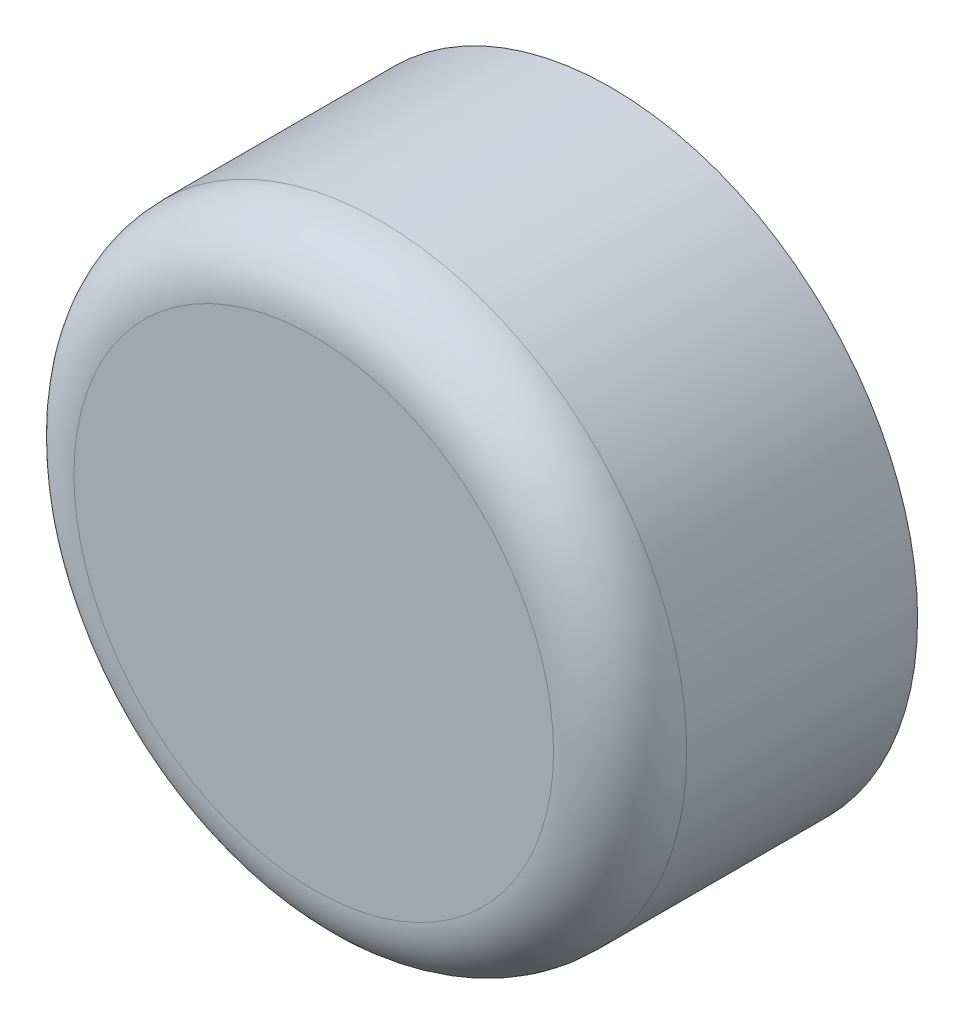
ISO-10303-21;
HEADER;
FILE_DESCRIPTION(('STEP AP214'),'2;1');
FILE_NAME('part.step','',(''),(''),'','','');
FILE_SCHEMA(('AUTOMOTIVE_DESIGN { 1 0 10303 214 1 1 1 1 }'));
ENDSEC;
DATA;
#1=APPLICATION_CONTEXT('core data for automotive mechanical design processes');
#2=APPLICATION_PROTOCOL_DEFINITION('international standard','automotive_design',2000,#1);
#3=PRODUCT_CONTEXT('',#1,'mechanical');
#4=PRODUCT('Part','Part','',(#3));
#5=PRODUCT_RELATED_PRODUCT_CATEGORY('part','',(#4));
#6=PRODUCT_DEFINITION_FORMATION('','',#4);
#7=PRODUCT_DEFINITION_CONTEXT('part definition',#1,'design');
#8=PRODUCT_DEFINITION('design','',#6,#7);
#9=PRODUCT_DEFINITION_SHAPE('','',#8);
#10=(LENGTH_UNIT() NAMED_UNIT(*) SI_UNIT(.MILLI.,.METRE.));
#11=(NAMED_UNIT(*) PLANE_ANGLE_UNIT() SI_UNIT($,.RADIAN.));
#12=(NAMED_UNIT(*) SI_UNIT($,.STERADIAN.) SOLID_ANGLE_UNIT());
#13=UNCERTAINTY_MEASURE_WITH_UNIT(LENGTH_MEASURE(1.E-05),#10,'distance_accuracy_value','');
#14=(GEOMETRIC_REPRESENTATION_CONTEXT(3) GLOBAL_UNCERTAINTY_ASSIGNED_CONTEXT((#13)) GLOBAL_UNIT_ASSIGNED_CONTEXT((#10,
#11,#12)) REPRESENTATION_CONTEXT('',''));
#15=CARTESIAN_POINT('',(0.,0.,0.));
#16=DIRECTION('',(0.,0.,1.));
#17=DIRECTION('',(1.,0.,0.));
#18=AXIS2_PLACEMENT_3D('',#15,#16,#17);
#19=CARTESIAN_POINT('',(0.,0.,1.3208));
#20=DIRECTION('',(0.,0.,1.));
#21=DIRECTION('',(1.,0.,0.));
#22=AXIS2_PLACEMENT_3D('',#19,#20,#21);
#23=TOROIDAL_SURFACE('',#22,1.3716,0.381);
#24=CARTESIAN_POINT('',(0.,0.,1.3208));
#25=DIRECTION('',(0.,0.,1.));
#26=DIRECTION('',(-1.,0.,0.));
#27=AXIS2_PLACEMENT_3D('',#24,#25,#26);
#28=CIRCLE('',#27,1.7526);
#29=CARTESIAN_POINT('',(1.7526,0.,1.3208));
#30=VERTEX_POINT('',#29);
#31=EDGE_CURVE('E11',#30,#30,#28,.T.);
#32=ORIENTED_EDGE('',*,*,#31,.T.);
#33=CARTESIAN_POINT('',(1.75260000000001,0.,1.32079999999995));
#34=CARTESIAN_POINT('',(1.75259999999996,0.,1.42265531438122));
#35=CARTESIAN_POINT('',(1.72021334240857,0.,1.52185696615386));
#36=CARTESIAN_POINT('',(1.65808133453009,0.,1.60728133453004));
#37=CARTESIAN_POINT('',(1.57265696615383,0.,1.66941334240859));
#38=CARTESIAN_POINT('',(1.47345531438122,0.,1.70179999999997));
#39=CARTESIAN_POINT('',(1.37160000000005,0.,1.70180000000001));
#40=(BOUNDED_CURVE() B_SPLINE_CURVE(6,(#33,#34,#35,#36,#37,#38,#39),.UNSPECIFIED.,.F.,
.F.) B_SPLINE_CURVE_WITH_KNOTS((7,7),(0.,1.5707963267949),
.UNSPECIFIED.) CURVE() GEOMETRIC_REPRESENTATION_ITEM() RATIONAL_B_SPLINE_CURVE((1.03139347178751,
1.01002540766144,0.997924642724974,0.993958444136924,0.997924642724975,1.01002540766144,1.03139347178751)) REPRESENTATION_ITEM(''));
#41=CARTESIAN_POINT('',(1.3716,0.,1.7018));
#42=VERTEX_POINT('',#41);
#43=EDGE_CURVE('E24',#30,#42,#40,.T.);
#44=ORIENTED_EDGE('',*,*,#43,.T.);
#45=CARTESIAN_POINT('',(0.,0.,1.7018));
#46=DIRECTION('',(0.,0.,-1.));
#47=DIRECTION('',(-1.,0.,0.));
#48=AXIS2_PLACEMENT_3D('',#45,#46,#47);
#49=CIRCLE('',#48,1.3716);
#50=EDGE_CURVE('E42',#42,#42,#49,.T.);
#51=ORIENTED_EDGE('',*,*,#50,.T.);
#52=ORIENTED_EDGE('',*,*,#43,.F.);
#53=EDGE_LOOP('',(#32,#44,#51,#52));
#54=FACE_BOUND('',#53,.T.);
#55=ADVANCED_FACE('F17',(#54),#23,.T.);
#56=CARTESIAN_POINT('',(0.,0.,0.));
#57=DIRECTION('',(0.,0.,1.));
#58=DIRECTION('',(1.,0.,0.));
#59=AXIS2_PLACEMENT_3D('',#56,#57,#58);
#60=CYLINDRICAL_SURFACE('',#59,1.7526);
#61=CARTESIAN_POINT('',(0.,0.,0.));
#62=DIRECTION('',(0.,0.,1.));
#63=DIRECTION('',(1.,0.,0.));
#64=AXIS2_PLACEMENT_3D('',#61,#62,#63);
#65=CIRCLE('',#64,1.7526);
#66=CARTESIAN_POINT('',(1.7526,0.,0.));
#67=VERTEX_POINT('',#66);
#68=EDGE_CURVE('E38',#67,#67,#65,.T.);
#69=ORIENTED_EDGE('',*,*,#68,.T.);
#70=CARTESIAN_POINT('',(1.7526,0.,0.));
#71=CARTESIAN_POINT('',(1.7526,0.,1.3208));
#72=B_SPLINE_CURVE_WITH_KNOTS('',1,(#70,#71),.UNSPECIFIED.,.F.,.F.,(2,2),(0.,1.3208),.UNSPECIFIED.);
#73=EDGE_CURVE('E40',#67,#30,#72,.T.);
#74=ORIENTED_EDGE('',*,*,#73,.T.);
#75=ORIENTED_EDGE('',*,*,#31,.F.);
#76=ORIENTED_EDGE('',*,*,#73,.F.);
#77=EDGE_LOOP('',(#69,#74,#75,#76));
#78=FACE_BOUND('',#77,.T.);
#79=ADVANCED_FACE('F39',(#78),#60,.T.);
#80=CARTESIAN_POINT('',(0.,0.,1.7018));
#81=DIRECTION('',(0.,0.,-1.));
#82=DIRECTION('',(-1.,0.,0.));
#83=AXIS2_PLACEMENT_3D('',#80,#81,#82);
#84=PLANE('',#83);
#85=ORIENTED_EDGE('',*,*,#50,.F.);
#86=EDGE_LOOP('',(#85));
#87=FACE_BOUND('',#86,.T.);
#88=ADVANCED_FACE('F58',(#87),#84,.F.);
#89=CARTESIAN_POINT('',(0.,0.,0.));
#90=DIRECTION('',(0.,0.,1.));
#91=DIRECTION('',(1.,0.,0.));
#92=AXIS2_PLACEMENT_3D('',#89,#90,#91);
#93=PLANE('',#92);
#94=ORIENTED_EDGE('',*,*,#68,.F.);
#95=EDGE_LOOP('',(#94));
#96=FACE_BOUND('',#95,.T.);
#97=ADVANCED_FACE('F60',(#96),#93,.F.);
#98=CLOSED_SHELL('',(#55,#79,#88,#97));
#99=MANIFOLD_SOLID_BREP('B1',#98);
#100=ADVANCED_BREP_SHAPE_REPRESENTATION('',(#18,#99),#14);
#101=SHAPE_DEFINITION_REPRESENTATION(#9,#100);
ENDSEC;
END-ISO-10303-21;
